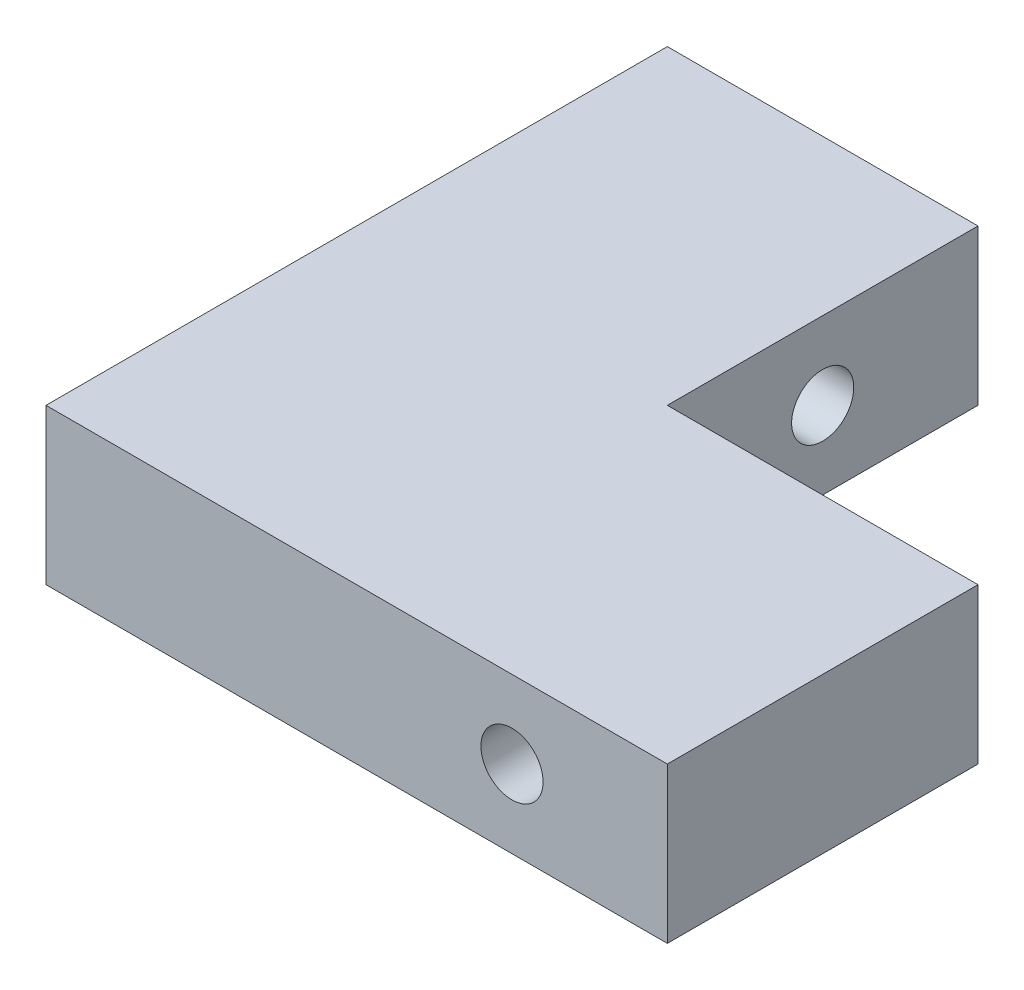
ISO-10303-21;
HEADER;
FILE_DESCRIPTION(('STEP AP214'),'2;1');
FILE_NAME('part.step','',(''),(''),'','','');
FILE_SCHEMA(('AUTOMOTIVE_DESIGN { 1 0 10303 214 1 1 1 1 }'));
ENDSEC;
DATA;
#1=APPLICATION_CONTEXT('core data for automotive mechanical design processes');
#2=APPLICATION_PROTOCOL_DEFINITION('international standard','automotive_design',2000,#1);
#3=PRODUCT_CONTEXT('',#1,'mechanical');
#4=PRODUCT('Part','Part','',(#3));
#5=PRODUCT_RELATED_PRODUCT_CATEGORY('part','',(#4));
#6=PRODUCT_DEFINITION_FORMATION('','',#4);
#7=PRODUCT_DEFINITION_CONTEXT('part definition',#1,'design');
#8=PRODUCT_DEFINITION('design','',#6,#7);
#9=PRODUCT_DEFINITION_SHAPE('','',#8);
#10=(LENGTH_UNIT() NAMED_UNIT(*) SI_UNIT(.MILLI.,.METRE.));
#11=(NAMED_UNIT(*) PLANE_ANGLE_UNIT() SI_UNIT($,.RADIAN.));
#12=(NAMED_UNIT(*) SI_UNIT($,.STERADIAN.) SOLID_ANGLE_UNIT());
#13=UNCERTAINTY_MEASURE_WITH_UNIT(LENGTH_MEASURE(1.E-05),#10,'distance_accuracy_value','');
#14=(GEOMETRIC_REPRESENTATION_CONTEXT(3) GLOBAL_UNCERTAINTY_ASSIGNED_CONTEXT((#13)) GLOBAL_UNIT_ASSIGNED_CONTEXT((#10,
#11,#12)) REPRESENTATION_CONTEXT('',''));
#15=CARTESIAN_POINT('',(0.,0.,0.));
#16=DIRECTION('',(0.,0.,1.));
#17=DIRECTION('',(1.,0.,0.));
#18=AXIS2_PLACEMENT_3D('',#15,#16,#17);
#19=CARTESIAN_POINT('',(-30.,20.,-36.304347826087));
#20=DIRECTION('',(0.,0.,1.));
#21=DIRECTION('',(1.,0.,0.));
#22=AXIS2_PLACEMENT_3D('',#19,#20,#21);
#23=PLANE('',#22);
#24=DIRECTION('',(-1.,0.,0.));
#25=VECTOR('',#24,1.);
#26=CARTESIAN_POINT('',(-30.,0.,-36.304347826087));
#27=LINE('',#26,#25);
#28=CARTESIAN_POINT('',(-30.,0.,-36.304347826087));
#29=VERTEX_POINT('',#28);
#30=CARTESIAN_POINT('',(-70.,0.,-36.3043478260869));
#31=VERTEX_POINT('',#30);
#32=EDGE_CURVE('E117',#29,#31,#27,.T.);
#33=ORIENTED_EDGE('',*,*,#32,.T.);
#34=DIRECTION('',(0.,-1.,0.));
#35=VECTOR('',#34,1.);
#36=CARTESIAN_POINT('',(-70.,20.,-36.3043478260869));
#37=LINE('',#36,#35);
#38=CARTESIAN_POINT('',(-70.,20.,-36.3043478260869));
#39=VERTEX_POINT('',#38);
#40=EDGE_CURVE('E11',#39,#31,#37,.T.);
#41=ORIENTED_EDGE('',*,*,#40,.F.);
#42=DIRECTION('',(-1.,0.,0.));
#43=VECTOR('',#42,1.);
#44=CARTESIAN_POINT('',(-30.,20.,-36.304347826087));
#45=LINE('',#44,#43);
#46=CARTESIAN_POINT('',(-30.,20.,-36.304347826087));
#47=VERTEX_POINT('',#46);
#48=EDGE_CURVE('E128',#47,#39,#45,.T.);
#49=ORIENTED_EDGE('',*,*,#48,.F.);
#50=DIRECTION('',(0.,-1.,0.));
#51=VECTOR('',#50,1.);
#52=CARTESIAN_POINT('',(-30.,20.,-36.304347826087));
#53=LINE('',#52,#51);
#54=EDGE_CURVE('E113',#47,#29,#53,.T.);
#55=ORIENTED_EDGE('',*,*,#54,.T.);
#56=EDGE_LOOP('',(#33,#41,#49,#55));
#57=FACE_BOUND('',#56,.T.);
#58=ADVANCED_FACE('F33',(#57),#23,.F.);
#59=CARTESIAN_POINT('',(-70.,20.,-36.3043478260869));
#60=DIRECTION('',(1.,0.,0.));
#61=DIRECTION('',(0.,0.,-1.));
#62=AXIS2_PLACEMENT_3D('',#59,#60,#61);
#63=PLANE('',#62);
#64=CARTESIAN_POINT('',(-70.,10.,-16.304347826087));
#65=DIRECTION('',(1.,0.,0.));
#66=DIRECTION('',(0.,0.,-1.));
#67=AXIS2_PLACEMENT_3D('',#64,#65,#66);
#68=CIRCLE('',#67,4.);
#69=CARTESIAN_POINT('',(-70.,10.,-20.304347826087));
#70=VERTEX_POINT('',#69);
#71=EDGE_CURVE('E121',#70,#70,#68,.T.);
#72=ORIENTED_EDGE('',*,*,#71,.T.);
#73=EDGE_LOOP('',(#72));
#74=FACE_BOUND('',#73,.T.);
#75=DIRECTION('',(0.,0.,1.));
#76=VECTOR('',#75,1.);
#77=CARTESIAN_POINT('',(-70.,0.,-36.3043478260869));
#78=LINE('',#77,#76);
#79=CARTESIAN_POINT('',(-70.,0.,43.695652173913));
#80=VERTEX_POINT('',#79);
#81=EDGE_CURVE('E120',#31,#80,#78,.T.);
#82=ORIENTED_EDGE('',*,*,#81,.T.);
#83=DIRECTION('',(0.,-1.,0.));
#84=VECTOR('',#83,1.);
#85=CARTESIAN_POINT('',(-70.,20.,43.695652173913));
#86=LINE('',#85,#84);
#87=CARTESIAN_POINT('',(-70.,20.,43.695652173913));
#88=VERTEX_POINT('',#87);
#89=EDGE_CURVE('E41',#88,#80,#86,.T.);
#90=ORIENTED_EDGE('',*,*,#89,.F.);
#91=DIRECTION('',(0.,0.,1.));
#92=VECTOR('',#91,1.);
#93=CARTESIAN_POINT('',(-70.,20.,-36.3043478260869));
#94=LINE('',#93,#92);
#95=EDGE_CURVE('E86',#39,#88,#94,.T.);
#96=ORIENTED_EDGE('',*,*,#95,.F.);
#97=ORIENTED_EDGE('',*,*,#40,.T.);
#98=EDGE_LOOP('',(#82,#90,#96,#97));
#99=FACE_BOUND('',#98,.T.);
#100=ADVANCED_FACE('F155',(#74,#99),#63,.F.);
#101=CARTESIAN_POINT('',(-70.,20.,43.695652173913));
#102=DIRECTION('',(0.,0.,-1.));
#103=DIRECTION('',(-1.,0.,0.));
#104=AXIS2_PLACEMENT_3D('',#101,#102,#103);
#105=PLANE('',#104);
#106=CARTESIAN_POINT('',(-10.,10.,43.695652173913));
#107=DIRECTION('',(0.,0.,-1.));
#108=DIRECTION('',(-1.,0.,0.));
#109=AXIS2_PLACEMENT_3D('',#106,#107,#108);
#110=CIRCLE('',#109,4.);
#111=CARTESIAN_POINT('',(-14.,10.,43.695652173913));
#112=VERTEX_POINT('',#111);
#113=EDGE_CURVE('E235',#112,#112,#110,.T.);
#114=ORIENTED_EDGE('',*,*,#113,.T.);
#115=EDGE_LOOP('',(#114));
#116=FACE_BOUND('',#115,.T.);
#117=DIRECTION('',(1.,0.,0.));
#118=VECTOR('',#117,1.);
#119=CARTESIAN_POINT('',(-70.,0.,43.695652173913));
#120=LINE('',#119,#118);
#121=CARTESIAN_POINT('',(10.,0.,43.695652173913));
#122=VERTEX_POINT('',#121);
#123=EDGE_CURVE('E123',#80,#122,#120,.T.);
#124=ORIENTED_EDGE('',*,*,#123,.T.);
#125=DIRECTION('',(0.,-1.,0.));
#126=VECTOR('',#125,1.);
#127=CARTESIAN_POINT('',(10.,20.,43.695652173913));
#128=LINE('',#127,#126);
#129=CARTESIAN_POINT('',(10.,20.,43.695652173913));
#130=VERTEX_POINT('',#129);
#131=EDGE_CURVE('E108',#130,#122,#128,.T.);
#132=ORIENTED_EDGE('',*,*,#131,.F.);
#133=DIRECTION('',(1.,0.,0.));
#134=VECTOR('',#133,1.);
#135=CARTESIAN_POINT('',(-70.,20.,43.695652173913));
#136=LINE('',#135,#134);
#137=EDGE_CURVE('E99',#88,#130,#136,.T.);
#138=ORIENTED_EDGE('',*,*,#137,.F.);
#139=ORIENTED_EDGE('',*,*,#89,.T.);
#140=EDGE_LOOP('',(#124,#132,#138,#139));
#141=FACE_BOUND('',#140,.T.);
#142=ADVANCED_FACE('F134',(#116,#141),#105,.F.);
#143=CARTESIAN_POINT('',(10.,20.,43.695652173913));
#144=DIRECTION('',(-1.,0.,0.));
#145=DIRECTION('',(0.,0.,1.));
#146=AXIS2_PLACEMENT_3D('',#143,#144,#145);
#147=PLANE('',#146);
#148=DIRECTION('',(0.,0.,-1.));
#149=VECTOR('',#148,1.);
#150=CARTESIAN_POINT('',(10.,0.,43.695652173913));
#151=LINE('',#150,#149);
#152=CARTESIAN_POINT('',(10.,0.,3.69565217391304));
#153=VERTEX_POINT('',#152);
#154=EDGE_CURVE('E107',#122,#153,#151,.T.);
#155=ORIENTED_EDGE('',*,*,#154,.T.);
#156=DIRECTION('',(0.,-1.,0.));
#157=VECTOR('',#156,1.);
#158=CARTESIAN_POINT('',(10.,20.,3.69565217391304));
#159=LINE('',#158,#157);
#160=CARTESIAN_POINT('',(10.,20.,3.69565217391304));
#161=VERTEX_POINT('',#160);
#162=EDGE_CURVE('E104',#161,#153,#159,.T.);
#163=ORIENTED_EDGE('',*,*,#162,.F.);
#164=DIRECTION('',(0.,0.,-1.));
#165=VECTOR('',#164,1.);
#166=CARTESIAN_POINT('',(10.,20.,43.695652173913));
#167=LINE('',#166,#165);
#168=EDGE_CURVE('E93',#130,#161,#167,.T.);
#169=ORIENTED_EDGE('',*,*,#168,.F.);
#170=ORIENTED_EDGE('',*,*,#131,.T.);
#171=EDGE_LOOP('',(#155,#163,#169,#170));
#172=FACE_BOUND('',#171,.T.);
#173=ADVANCED_FACE('F105',(#172),#147,.F.);
#174=CARTESIAN_POINT('',(10.,20.,3.69565217391304));
#175=DIRECTION('',(0.,0.,1.));
#176=DIRECTION('',(1.,0.,0.));
#177=AXIS2_PLACEMENT_3D('',#174,#175,#176);
#178=PLANE('',#177);
#179=CARTESIAN_POINT('',(-10.,10.,3.69565217391304));
#180=DIRECTION('',(0.,0.,-1.));
#181=DIRECTION('',(-1.,0.,0.));
#182=AXIS2_PLACEMENT_3D('',#179,#180,#181);
#183=CIRCLE('',#182,4.);
#184=CARTESIAN_POINT('',(-14.,10.,3.69565217391304));
#185=VERTEX_POINT('',#184);
#186=EDGE_CURVE('E239',#185,#185,#183,.T.);
#187=ORIENTED_EDGE('',*,*,#186,.F.);
#188=EDGE_LOOP('',(#187));
#189=FACE_BOUND('',#188,.T.);
#190=DIRECTION('',(-1.,0.,0.));
#191=VECTOR('',#190,1.);
#192=CARTESIAN_POINT('',(10.,0.,3.69565217391304));
#193=LINE('',#192,#191);
#194=CARTESIAN_POINT('',(-30.,0.,3.69565217391305));
#195=VERTEX_POINT('',#194);
#196=EDGE_CURVE('E72',#153,#195,#193,.T.);
#197=ORIENTED_EDGE('',*,*,#196,.T.);
#198=DIRECTION('',(0.,-1.,0.));
#199=VECTOR('',#198,1.);
#200=CARTESIAN_POINT('',(-30.,20.,3.69565217391305));
#201=LINE('',#200,#199);
#202=CARTESIAN_POINT('',(-30.,20.,3.69565217391305));
#203=VERTEX_POINT('',#202);
#204=EDGE_CURVE('E109',#203,#195,#201,.T.);
#205=ORIENTED_EDGE('',*,*,#204,.F.);
#206=DIRECTION('',(-1.,0.,0.));
#207=VECTOR('',#206,1.);
#208=CARTESIAN_POINT('',(10.,20.,3.69565217391304));
#209=LINE('',#208,#207);
#210=EDGE_CURVE('E97',#161,#203,#209,.T.);
#211=ORIENTED_EDGE('',*,*,#210,.F.);
#212=ORIENTED_EDGE('',*,*,#162,.T.);
#213=EDGE_LOOP('',(#197,#205,#211,#212));
#214=FACE_BOUND('',#213,.T.);
#215=ADVANCED_FACE('F111',(#189,#214),#178,.F.);
#216=CARTESIAN_POINT('',(-30.,20.,3.69565217391305));
#217=DIRECTION('',(-1.,0.,0.));
#218=DIRECTION('',(0.,0.,1.));
#219=AXIS2_PLACEMENT_3D('',#216,#217,#218);
#220=PLANE('',#219);
#221=CARTESIAN_POINT('',(-30.,10.,-16.304347826087));
#222=DIRECTION('',(1.,0.,0.));
#223=DIRECTION('',(0.,0.,-1.));
#224=AXIS2_PLACEMENT_3D('',#221,#222,#223);
#225=CIRCLE('',#224,4.);
#226=CARTESIAN_POINT('',(-30.,10.,-20.304347826087));
#227=VERTEX_POINT('',#226);
#228=EDGE_CURVE('E234',#227,#227,#225,.T.);
#229=ORIENTED_EDGE('',*,*,#228,.F.);
#230=EDGE_LOOP('',(#229));
#231=FACE_BOUND('',#230,.T.);
#232=DIRECTION('',(0.,0.,-1.));
#233=VECTOR('',#232,1.);
#234=CARTESIAN_POINT('',(-30.,0.,3.69565217391305));
#235=LINE('',#234,#233);
#236=EDGE_CURVE('E78',#195,#29,#235,.T.);
#237=ORIENTED_EDGE('',*,*,#236,.T.);
#238=ORIENTED_EDGE('',*,*,#54,.F.);
#239=DIRECTION('',(0.,0.,-1.));
#240=VECTOR('',#239,1.);
#241=CARTESIAN_POINT('',(-30.,20.,3.69565217391305));
#242=LINE('',#241,#240);
#243=EDGE_CURVE('E49',#203,#47,#242,.T.);
#244=ORIENTED_EDGE('',*,*,#243,.F.);
#245=ORIENTED_EDGE('',*,*,#204,.T.);
#246=EDGE_LOOP('',(#237,#238,#244,#245));
#247=FACE_BOUND('',#246,.T.);
#248=ADVANCED_FACE('F141',(#231,#247),#220,.F.);
#249=CARTESIAN_POINT('',(0.,20.,0.));
#250=DIRECTION('',(0.,1.,0.));
#251=DIRECTION('',(0.,0.,1.));
#252=AXIS2_PLACEMENT_3D('',#249,#250,#251);
#253=PLANE('',#252);
#254=ORIENTED_EDGE('',*,*,#48,.T.);
#255=ORIENTED_EDGE('',*,*,#95,.T.);
#256=ORIENTED_EDGE('',*,*,#137,.T.);
#257=ORIENTED_EDGE('',*,*,#168,.T.);
#258=ORIENTED_EDGE('',*,*,#210,.T.);
#259=ORIENTED_EDGE('',*,*,#243,.T.);
#260=EDGE_LOOP('',(#254,#255,#256,#257,#258,#259));
#261=FACE_BOUND('',#260,.T.);
#262=ADVANCED_FACE('F95',(#261),#253,.T.);
#263=CARTESIAN_POINT('',(0.,0.,0.));
#264=DIRECTION('',(0.,1.,0.));
#265=DIRECTION('',(0.,0.,1.));
#266=AXIS2_PLACEMENT_3D('',#263,#264,#265);
#267=PLANE('',#266);
#268=ORIENTED_EDGE('',*,*,#32,.F.);
#269=ORIENTED_EDGE('',*,*,#236,.F.);
#270=ORIENTED_EDGE('',*,*,#196,.F.);
#271=ORIENTED_EDGE('',*,*,#154,.F.);
#272=ORIENTED_EDGE('',*,*,#123,.F.);
#273=ORIENTED_EDGE('',*,*,#81,.F.);
#274=EDGE_LOOP('',(#268,#269,#270,#271,#272,#273));
#275=FACE_BOUND('',#274,.T.);
#276=ADVANCED_FACE('F137',(#275),#267,.F.);
#277=CARTESIAN_POINT('',(-70.,10.,-16.304347826087));
#278=DIRECTION('',(1.,0.,0.));
#279=DIRECTION('',(0.,0.,-1.));
#280=AXIS2_PLACEMENT_3D('',#277,#278,#279);
#281=CYLINDRICAL_SURFACE('',#280,4.);
#282=ORIENTED_EDGE('',*,*,#71,.F.);
#283=EDGE_LOOP('',(#282));
#284=FACE_BOUND('',#283,.T.);
#285=ORIENTED_EDGE('',*,*,#228,.T.);
#286=EDGE_LOOP('',(#285));
#287=FACE_BOUND('',#286,.T.);
#288=ADVANCED_FACE('F190',(#284,#287),#281,.F.);
#289=CARTESIAN_POINT('',(-10.,10.,43.695652173913));
#290=DIRECTION('',(0.,0.,-1.));
#291=DIRECTION('',(-1.,0.,0.));
#292=AXIS2_PLACEMENT_3D('',#289,#290,#291);
#293=CYLINDRICAL_SURFACE('',#292,4.);
#294=ORIENTED_EDGE('',*,*,#113,.F.);
#295=EDGE_LOOP('',(#294));
#296=FACE_BOUND('',#295,.T.);
#297=ORIENTED_EDGE('',*,*,#186,.T.);
#298=EDGE_LOOP('',(#297));
#299=FACE_BOUND('',#298,.T.);
#300=ADVANCED_FACE('F186',(#296,#299),#293,.F.);
#301=CLOSED_SHELL('',(#58,#100,#142,#173,#215,#248,#262,#276,#288,#300));
#302=MANIFOLD_SOLID_BREP('B2',#301);
#303=ADVANCED_BREP_SHAPE_REPRESENTATION('',(#18,#302),#14);
#304=SHAPE_DEFINITION_REPRESENTATION(#9,#303);
ENDSEC;
END-ISO-10303-21;
